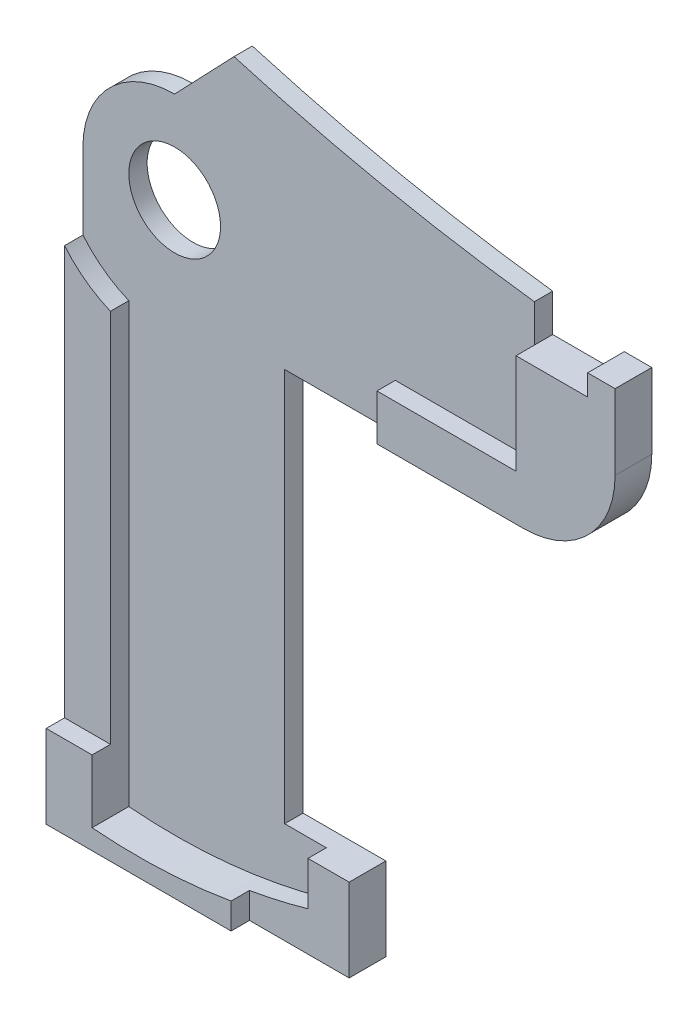
ISO-10303-21;
HEADER;
FILE_DESCRIPTION(('STEP AP214'),'2;1');
FILE_NAME('part.step','',(''),(''),'','','');
FILE_SCHEMA(('AUTOMOTIVE_DESIGN { 1 0 10303 214 1 1 1 1 }'));
ENDSEC;
DATA;
#1=APPLICATION_CONTEXT('core data for automotive mechanical design processes');
#2=APPLICATION_PROTOCOL_DEFINITION('international standard','automotive_design',2000,#1);
#3=PRODUCT_CONTEXT('',#1,'mechanical');
#4=PRODUCT('Part','Part','',(#3));
#5=PRODUCT_RELATED_PRODUCT_CATEGORY('part','',(#4));
#6=PRODUCT_DEFINITION_FORMATION('','',#4);
#7=PRODUCT_DEFINITION_CONTEXT('part definition',#1,'design');
#8=PRODUCT_DEFINITION('design','',#6,#7);
#9=PRODUCT_DEFINITION_SHAPE('','',#8);
#10=(LENGTH_UNIT() NAMED_UNIT(*) SI_UNIT(.MILLI.,.METRE.));
#11=(NAMED_UNIT(*) PLANE_ANGLE_UNIT() SI_UNIT($,.RADIAN.));
#12=(NAMED_UNIT(*) SI_UNIT($,.STERADIAN.) SOLID_ANGLE_UNIT());
#13=UNCERTAINTY_MEASURE_WITH_UNIT(LENGTH_MEASURE(1.E-05),#10,'distance_accuracy_value','');
#14=(GEOMETRIC_REPRESENTATION_CONTEXT(3) GLOBAL_UNCERTAINTY_ASSIGNED_CONTEXT((#13)) GLOBAL_UNIT_ASSIGNED_CONTEXT((#10,
#11,#12)) REPRESENTATION_CONTEXT('',''));
#15=CARTESIAN_POINT('',(0.,0.,0.));
#16=DIRECTION('',(0.,0.,1.));
#17=DIRECTION('',(1.,0.,0.));
#18=AXIS2_PLACEMENT_3D('',#15,#16,#17);
#19=CARTESIAN_POINT('',(0.,0.,3.));
#20=DIRECTION('',(0.,0.,-1.));
#21=DIRECTION('',(-1.,0.,0.));
#22=AXIS2_PLACEMENT_3D('',#19,#20,#21);
#23=CYLINDRICAL_SURFACE('',#22,29.9788961882798);
#24=CARTESIAN_POINT('',(0.,0.,1.));
#25=DIRECTION('',(0.,0.,1.));
#26=DIRECTION('',(1.,0.,0.));
#27=AXIS2_PLACEMENT_3D('',#24,#25,#26);
#28=CIRCLE('',#27,29.9788961882798);
#29=CARTESIAN_POINT('',(-2.5,-29.8744743329093,1.));
#30=VERTEX_POINT('',#29);
#31=CARTESIAN_POINT('',(8.264928228499,-28.8170987097143,1.));
#32=VERTEX_POINT('',#31);
#33=EDGE_CURVE('E296',#30,#32,#28,.T.);
#34=ORIENTED_EDGE('',*,*,#33,.F.);
#35=DIRECTION('',(0.,0.,-1.));
#36=VECTOR('',#35,1.);
#37=CARTESIAN_POINT('',(-2.5,-29.8744743329093,3.));
#38=LINE('',#37,#36);
#39=CARTESIAN_POINT('',(-2.5,-29.8744743329093,3.));
#40=VERTEX_POINT('',#39);
#41=EDGE_CURVE('E11',#40,#30,#38,.T.);
#42=ORIENTED_EDGE('',*,*,#41,.F.);
#43=CARTESIAN_POINT('',(0.,0.,3.));
#44=DIRECTION('',(0.,0.,1.));
#45=DIRECTION('',(1.,0.,0.));
#46=AXIS2_PLACEMENT_3D('',#43,#44,#45);
#47=CIRCLE('',#46,29.9788961882798);
#48=CARTESIAN_POINT('',(5.07614132551865,-29.5460150597507,3.));
#49=VERTEX_POINT('',#48);
#50=EDGE_CURVE('E425',#40,#49,#47,.T.);
#51=ORIENTED_EDGE('',*,*,#50,.T.);
#52=DIRECTION('',(0.,0.,-1.));
#53=VECTOR('',#52,1.);
#54=CARTESIAN_POINT('',(5.07614132551865,-29.5460150597507,3.));
#55=LINE('',#54,#53);
#56=CARTESIAN_POINT('',(5.07614132551865,-29.5460150597507,2.));
#57=VERTEX_POINT('',#56);
#58=EDGE_CURVE('E441',#49,#57,#55,.T.);
#59=ORIENTED_EDGE('',*,*,#58,.T.);
#60=CARTESIAN_POINT('',(0.,0.,2.));
#61=DIRECTION('',(0.,0.,1.));
#62=DIRECTION('',(1.,0.,0.));
#63=AXIS2_PLACEMENT_3D('',#60,#61,#62);
#64=CIRCLE('',#63,29.9788961882798);
#65=CARTESIAN_POINT('',(8.264928228499,-28.8170987097143,2.));
#66=VERTEX_POINT('',#65);
#67=EDGE_CURVE('E393',#57,#66,#64,.T.);
#68=ORIENTED_EDGE('',*,*,#67,.T.);
#69=DIRECTION('',(0.,0.,-1.));
#70=VECTOR('',#69,1.);
#71=CARTESIAN_POINT('',(8.264928228499,-28.8170987097143,2.));
#72=LINE('',#71,#70);
#73=EDGE_CURVE('E413',#66,#32,#72,.T.);
#74=ORIENTED_EDGE('',*,*,#73,.T.);
#75=EDGE_LOOP('',(#34,#42,#51,#59,#68,#74));
#76=FACE_BOUND('',#75,.T.);
#77=ADVANCED_FACE('F35',(#76),#23,.F.);
#78=CARTESIAN_POINT('',(-2.5,0.,3.));
#79=DIRECTION('',(-1.,0.,0.));
#80=DIRECTION('',(0.,0.,1.));
#81=AXIS2_PLACEMENT_3D('',#78,#79,#80);
#82=PLANE('',#81);
#83=ORIENTED_EDGE('',*,*,#41,.T.);
#84=DIRECTION('',(0.,1.,0.));
#85=VECTOR('',#84,1.);
#86=CARTESIAN_POINT('',(-2.5,0.,1.));
#87=LINE('',#86,#85);
#88=CARTESIAN_POINT('',(-2.5,-6.,1.));
#89=VERTEX_POINT('',#88);
#90=EDGE_CURVE('E293',#30,#89,#87,.T.);
#91=ORIENTED_EDGE('',*,*,#90,.T.);
#92=DIRECTION('',(0.,0.,-1.));
#93=VECTOR('',#92,1.);
#94=CARTESIAN_POINT('',(-2.5,-6.,2.));
#95=LINE('',#94,#93);
#96=CARTESIAN_POINT('',(-2.5,-6.,2.));
#97=VERTEX_POINT('',#96);
#98=EDGE_CURVE('E376',#97,#89,#95,.T.);
#99=ORIENTED_EDGE('',*,*,#98,.F.);
#100=DIRECTION('',(0.,-1.,0.));
#101=VECTOR('',#100,1.);
#102=CARTESIAN_POINT('',(-2.5,0.,2.));
#103=LINE('',#102,#101);
#104=CARTESIAN_POINT('',(-2.5,-26.4376778251583,2.));
#105=VERTEX_POINT('',#104);
#106=EDGE_CURVE('E373',#97,#105,#103,.T.);
#107=ORIENTED_EDGE('',*,*,#106,.T.);
#108=DIRECTION('',(0.,0.,-1.));
#109=VECTOR('',#108,1.);
#110=CARTESIAN_POINT('',(-2.5,-26.4376778251583,3.));
#111=LINE('',#110,#109);
#112=CARTESIAN_POINT('',(-2.5,-26.4376778251583,3.));
#113=VERTEX_POINT('',#112);
#114=EDGE_CURVE('E43',#113,#105,#111,.T.);
#115=ORIENTED_EDGE('',*,*,#114,.F.);
#116=DIRECTION('',(0.,1.,0.));
#117=VECTOR('',#116,1.);
#118=CARTESIAN_POINT('',(-2.5,0.,3.));
#119=LINE('',#118,#117);
#120=EDGE_CURVE('E428',#40,#113,#119,.T.);
#121=ORIENTED_EDGE('',*,*,#120,.F.);
#122=EDGE_LOOP('',(#83,#91,#99,#107,#115,#121));
#123=FACE_BOUND('',#122,.T.);
#124=ADVANCED_FACE('F480',(#123),#82,.F.);
#125=CARTESIAN_POINT('',(0.,-26.4376778251583,3.));
#126=DIRECTION('',(0.,-1.,0.));
#127=DIRECTION('',(0.,0.,-1.));
#128=AXIS2_PLACEMENT_3D('',#125,#126,#127);
#129=PLANE('',#128);
#130=ORIENTED_EDGE('',*,*,#114,.T.);
#131=DIRECTION('',(-1.,0.,0.));
#132=VECTOR('',#131,1.);
#133=CARTESIAN_POINT('',(0.,-26.4376778251583,2.));
#134=LINE('',#133,#132);
#135=CARTESIAN_POINT('',(-5.,-26.4376778251583,2.));
#136=VERTEX_POINT('',#135);
#137=EDGE_CURVE('E371',#105,#136,#134,.T.);
#138=ORIENTED_EDGE('',*,*,#137,.T.);
#139=DIRECTION('',(0.,0.,-1.));
#140=VECTOR('',#139,1.);
#141=CARTESIAN_POINT('',(-5.,-26.4376778251583,3.));
#142=LINE('',#141,#140);
#143=CARTESIAN_POINT('',(-5.,-26.4376778251583,3.));
#144=VERTEX_POINT('',#143);
#145=EDGE_CURVE('E449',#144,#136,#142,.T.);
#146=ORIENTED_EDGE('',*,*,#145,.F.);
#147=DIRECTION('',(-1.,0.,0.));
#148=VECTOR('',#147,1.);
#149=CARTESIAN_POINT('',(0.,-26.4376778251583,3.));
#150=LINE('',#149,#148);
#151=EDGE_CURVE('E431',#113,#144,#150,.T.);
#152=ORIENTED_EDGE('',*,*,#151,.F.);
#153=EDGE_LOOP('',(#130,#138,#146,#152));
#154=FACE_BOUND('',#153,.T.);
#155=ADVANCED_FACE('F525',(#154),#129,.F.);
#156=CARTESIAN_POINT('',(-5.,0.,3.));
#157=DIRECTION('',(-1.,0.,0.));
#158=DIRECTION('',(0.,-1.,0.));
#159=AXIS2_PLACEMENT_3D('',#156,#157,#158);
#160=PLANE('',#159);
#161=DIRECTION('',(0.,1.,0.));
#162=VECTOR('',#161,1.);
#163=CARTESIAN_POINT('',(-5.,0.,0.));
#164=LINE('',#163,#162);
#165=CARTESIAN_POINT('',(-5.,-30.96175737993,0.));
#166=VERTEX_POINT('',#165);
#167=CARTESIAN_POINT('',(-5.,0.,0.));
#168=VERTEX_POINT('',#167);
#169=EDGE_CURVE('E424',#166,#168,#164,.T.);
#170=ORIENTED_EDGE('',*,*,#169,.F.);
#171=DIRECTION('',(0.,0.,-1.));
#172=VECTOR('',#171,1.);
#173=CARTESIAN_POINT('',(-5.,-30.96175737993,3.));
#174=LINE('',#173,#172);
#175=CARTESIAN_POINT('',(-5.,-30.96175737993,3.));
#176=VERTEX_POINT('',#175);
#177=EDGE_CURVE('E451',#176,#166,#174,.T.);
#178=ORIENTED_EDGE('',*,*,#177,.F.);
#179=DIRECTION('',(0.,1.,0.));
#180=VECTOR('',#179,1.);
#181=CARTESIAN_POINT('',(-5.,0.,3.));
#182=LINE('',#181,#180);
#183=EDGE_CURVE('E433',#176,#144,#182,.T.);
#184=ORIENTED_EDGE('',*,*,#183,.T.);
#185=ORIENTED_EDGE('',*,*,#145,.T.);
#186=DIRECTION('',(0.,1.,0.));
#187=VECTOR('',#186,1.);
#188=CARTESIAN_POINT('',(-5.,0.,2.));
#189=LINE('',#188,#187);
#190=CARTESIAN_POINT('',(-5.,-4.15331193145904,2.));
#191=VERTEX_POINT('',#190);
#192=EDGE_CURVE('E368',#136,#191,#189,.T.);
#193=ORIENTED_EDGE('',*,*,#192,.T.);
#194=DIRECTION('',(0.,0.,-1.));
#195=VECTOR('',#194,1.);
#196=CARTESIAN_POINT('',(-5.,-4.15331193145904,2.));
#197=LINE('',#196,#195);
#198=CARTESIAN_POINT('',(-5.,-4.15331193145904,1.));
#199=VERTEX_POINT('',#198);
#200=EDGE_CURVE('E379',#191,#199,#197,.T.);
#201=ORIENTED_EDGE('',*,*,#200,.T.);
#202=DIRECTION('',(0.,1.,0.));
#203=VECTOR('',#202,1.);
#204=CARTESIAN_POINT('',(-5.,0.,1.));
#205=LINE('',#204,#203);
#206=CARTESIAN_POINT('',(-5.,0.,1.));
#207=VERTEX_POINT('',#206);
#208=EDGE_CURVE('E325',#199,#207,#205,.T.);
#209=ORIENTED_EDGE('',*,*,#208,.T.);
#210=DIRECTION('',(0.,0.,-1.));
#211=VECTOR('',#210,1.);
#212=CARTESIAN_POINT('',(-5.,0.,1.));
#213=LINE('',#212,#211);
#214=EDGE_CURVE('E333',#207,#168,#213,.T.);
#215=ORIENTED_EDGE('',*,*,#214,.T.);
#216=EDGE_LOOP('',(#170,#178,#184,#185,#193,#201,#209,#215));
#217=FACE_BOUND('',#216,.T.);
#218=ADVANCED_FACE('F490',(#217),#160,.T.);
#219=CARTESIAN_POINT('',(0.,-30.96175737993,3.));
#220=DIRECTION('',(0.,1.,0.));
#221=DIRECTION('',(0.,0.,1.));
#222=AXIS2_PLACEMENT_3D('',#219,#220,#221);
#223=PLANE('',#222);
#224=DIRECTION('',(1.,0.,0.));
#225=VECTOR('',#224,1.);
#226=CARTESIAN_POINT('',(0.,-30.96175737993,0.));
#227=LINE('',#226,#225);
#228=CARTESIAN_POINT('',(10.5082524027864,-30.96175737993,0.));
#229=VERTEX_POINT('',#228);
#230=EDGE_CURVE('E429',#166,#229,#227,.T.);
#231=ORIENTED_EDGE('',*,*,#230,.T.);
#232=DIRECTION('',(0.,0.,-1.));
#233=VECTOR('',#232,1.);
#234=CARTESIAN_POINT('',(10.5082524027864,-30.96175737993,2.));
#235=LINE('',#234,#233);
#236=CARTESIAN_POINT('',(10.5082524027864,-30.96175737993,2.));
#237=VERTEX_POINT('',#236);
#238=EDGE_CURVE('E421',#237,#229,#235,.T.);
#239=ORIENTED_EDGE('',*,*,#238,.F.);
#240=DIRECTION('',(1.,0.,0.));
#241=VECTOR('',#240,1.);
#242=CARTESIAN_POINT('',(0.,-30.96175737993,2.));
#243=LINE('',#242,#241);
#244=CARTESIAN_POINT('',(5.07614132551865,-30.96175737993,2.));
#245=VERTEX_POINT('',#244);
#246=EDGE_CURVE('E392',#245,#237,#243,.T.);
#247=ORIENTED_EDGE('',*,*,#246,.F.);
#248=DIRECTION('',(0.,0.,-1.));
#249=VECTOR('',#248,1.);
#250=CARTESIAN_POINT('',(5.07614132551865,-30.96175737993,3.));
#251=LINE('',#250,#249);
#252=CARTESIAN_POINT('',(5.07614132551865,-30.96175737993,3.));
#253=VERTEX_POINT('',#252);
#254=EDGE_CURVE('E394',#253,#245,#251,.T.);
#255=ORIENTED_EDGE('',*,*,#254,.F.);
#256=DIRECTION('',(1.,0.,0.));
#257=VECTOR('',#256,1.);
#258=CARTESIAN_POINT('',(0.,-30.96175737993,3.));
#259=LINE('',#258,#257);
#260=EDGE_CURVE('E436',#176,#253,#259,.T.);
#261=ORIENTED_EDGE('',*,*,#260,.F.);
#262=ORIENTED_EDGE('',*,*,#177,.T.);
#263=EDGE_LOOP('',(#231,#239,#247,#255,#261,#262));
#264=FACE_BOUND('',#263,.T.);
#265=ADVANCED_FACE('F463',(#264),#223,.F.);
#266=CARTESIAN_POINT('',(5.07614132551865,0.,3.));
#267=DIRECTION('',(1.,0.,0.));
#268=DIRECTION('',(0.,0.,-1.));
#269=AXIS2_PLACEMENT_3D('',#266,#267,#268);
#270=PLANE('',#269);
#271=DIRECTION('',(0.,-1.,0.));
#272=VECTOR('',#271,1.);
#273=CARTESIAN_POINT('',(5.07614132551865,0.,2.));
#274=LINE('',#273,#272);
#275=EDGE_CURVE('E388',#57,#245,#274,.T.);
#276=ORIENTED_EDGE('',*,*,#275,.F.);
#277=ORIENTED_EDGE('',*,*,#58,.F.);
#278=DIRECTION('',(0.,-1.,0.));
#279=VECTOR('',#278,1.);
#280=CARTESIAN_POINT('',(5.07614132551865,0.,3.));
#281=LINE('',#280,#279);
#282=EDGE_CURVE('E438',#49,#253,#281,.T.);
#283=ORIENTED_EDGE('',*,*,#282,.T.);
#284=ORIENTED_EDGE('',*,*,#254,.T.);
#285=EDGE_LOOP('',(#276,#277,#283,#284));
#286=FACE_BOUND('',#285,.T.);
#287=ADVANCED_FACE('F457',(#286),#270,.T.);
#288=CARTESIAN_POINT('',(0.,0.,3.));
#289=DIRECTION('',(0.,0.,1.));
#290=DIRECTION('',(1.,0.,0.));
#291=AXIS2_PLACEMENT_3D('',#288,#289,#290);
#292=PLANE('',#291);
#293=ORIENTED_EDGE('',*,*,#50,.F.);
#294=ORIENTED_EDGE('',*,*,#120,.T.);
#295=ORIENTED_EDGE('',*,*,#151,.T.);
#296=ORIENTED_EDGE('',*,*,#183,.F.);
#297=ORIENTED_EDGE('',*,*,#260,.T.);
#298=ORIENTED_EDGE('',*,*,#282,.F.);
#299=EDGE_LOOP('',(#293,#294,#295,#296,#297,#298));
#300=FACE_BOUND('',#299,.T.);
#301=ADVANCED_FACE('F485',(#300),#292,.T.);
#302=CARTESIAN_POINT('',(0.,0.,0.));
#303=DIRECTION('',(0.,0.,1.));
#304=DIRECTION('',(1.,0.,0.));
#305=AXIS2_PLACEMENT_3D('',#302,#303,#304);
#306=PLANE('',#305);
#307=CARTESIAN_POINT('',(20.,0.,0.));
#308=DIRECTION('',(0.,0.,1.));
#309=DIRECTION('',(1.,0.,0.));
#310=AXIS2_PLACEMENT_3D('',#307,#308,#309);
#311=CIRCLE('',#310,5.);
#312=CARTESIAN_POINT('',(25.,0.,0.));
#313=VERTEX_POINT('',#312);
#314=CARTESIAN_POINT('',(20.,-5.,0.));
#315=VERTEX_POINT('',#314);
#316=EDGE_CURVE('E227',#313,#315,#311,.F.);
#317=ORIENTED_EDGE('',*,*,#316,.T.);
#318=DIRECTION('',(-1.,0.,0.));
#319=VECTOR('',#318,1.);
#320=CARTESIAN_POINT('',(0.,-5.,0.));
#321=LINE('',#320,#319);
#322=CARTESIAN_POINT('',(5.99486892375012,-5.,0.));
#323=VERTEX_POINT('',#322);
#324=EDGE_CURVE('E336',#315,#323,#321,.T.);
#325=ORIENTED_EDGE('',*,*,#324,.T.);
#326=DIRECTION('',(0.,-1.,0.));
#327=VECTOR('',#326,1.);
#328=CARTESIAN_POINT('',(5.99486892375012,0.,0.));
#329=LINE('',#328,#327);
#330=CARTESIAN_POINT('',(5.99486892375012,-26.4376778251583,0.));
#331=VERTEX_POINT('',#330);
#332=EDGE_CURVE('E232',#323,#331,#329,.T.);
#333=ORIENTED_EDGE('',*,*,#332,.T.);
#334=DIRECTION('',(-1.,0.,0.));
#335=VECTOR('',#334,1.);
#336=CARTESIAN_POINT('',(0.,-26.4376778251583,0.));
#337=LINE('',#336,#335);
#338=CARTESIAN_POINT('',(10.5082524027864,-26.4376778251583,0.));
#339=VERTEX_POINT('',#338);
#340=EDGE_CURVE('E400',#339,#331,#337,.T.);
#341=ORIENTED_EDGE('',*,*,#340,.F.);
#342=DIRECTION('',(0.,1.,0.));
#343=VECTOR('',#342,1.);
#344=CARTESIAN_POINT('',(10.5082524027864,0.,0.));
#345=LINE('',#344,#343);
#346=EDGE_CURVE('E382',#229,#339,#345,.T.);
#347=ORIENTED_EDGE('',*,*,#346,.F.);
#348=ORIENTED_EDGE('',*,*,#230,.F.);
#349=ORIENTED_EDGE('',*,*,#169,.T.);
#350=CARTESIAN_POINT('',(0.,0.,0.));
#351=DIRECTION('',(0.,0.,1.));
#352=DIRECTION('',(1.,0.,0.));
#353=AXIS2_PLACEMENT_3D('',#350,#351,#352);
#354=CIRCLE('',#353,5.);
#355=CARTESIAN_POINT('',(0.,5.,0.));
#356=VERTEX_POINT('',#355);
#357=EDGE_CURVE('E347',#356,#168,#354,.T.);
#358=ORIENTED_EDGE('',*,*,#357,.F.);
#359=DIRECTION('',(0.690746158596746,0.723097327047915,0.));
#360=VECTOR('',#359,1.);
#361=CARTESIAN_POINT('',(-2.49738350474961,2.3856512780808,0.));
#362=LINE('',#361,#360);
#363=CARTESIAN_POINT('',(3.23191218549823,8.38327913011483,0.));
#364=VERTEX_POINT('',#363);
#365=EDGE_CURVE('E344',#356,#364,#362,.T.);
#366=ORIENTED_EDGE('',*,*,#365,.T.);
#367=CARTESIAN_POINT('',(32.2464718792214,107.468341250552,0.));
#368=DIRECTION('',(0.,0.,1.));
#369=DIRECTION('',(1.,0.,0.));
#370=AXIS2_PLACEMENT_3D('',#367,#368,#369);
#371=CIRCLE('',#370,103.245795118405);
#372=CARTESIAN_POINT('',(19.6,5.,0.));
#373=VERTEX_POINT('',#372);
#374=EDGE_CURVE('E341',#373,#364,#371,.F.);
#375=ORIENTED_EDGE('',*,*,#374,.F.);
#376=DIRECTION('',(0.,-1.,0.));
#377=VECTOR('',#376,1.);
#378=CARTESIAN_POINT('',(19.6,0.,0.));
#379=LINE('',#378,#377);
#380=CARTESIAN_POINT('',(19.6,2.95072846517236,0.));
#381=VERTEX_POINT('',#380);
#382=EDGE_CURVE('E339',#373,#381,#379,.T.);
#383=ORIENTED_EDGE('',*,*,#382,.T.);
#384=DIRECTION('',(1.,0.,0.));
#385=VECTOR('',#384,1.);
#386=CARTESIAN_POINT('',(0.,2.95072846517236,0.));
#387=LINE('',#386,#385);
#388=CARTESIAN_POINT('',(23.5024990927655,2.95072846517236,0.));
#389=VERTEX_POINT('',#388);
#390=EDGE_CURVE('E243',#381,#389,#387,.T.);
#391=ORIENTED_EDGE('',*,*,#390,.T.);
#392=DIRECTION('',(0.,1.,0.));
#393=VECTOR('',#392,1.);
#394=CARTESIAN_POINT('',(23.5024990927655,0.,0.));
#395=LINE('',#394,#393);
#396=CARTESIAN_POINT('',(23.5024990927655,4.0959165898472,0.));
#397=VERTEX_POINT('',#396);
#398=EDGE_CURVE('E270',#389,#397,#395,.T.);
#399=ORIENTED_EDGE('',*,*,#398,.T.);
#400=DIRECTION('',(1.,0.,0.));
#401=VECTOR('',#400,1.);
#402=CARTESIAN_POINT('',(0.,4.0959165898472,0.));
#403=LINE('',#402,#401);
#404=CARTESIAN_POINT('',(25.,4.0959165898472,0.));
#405=VERTEX_POINT('',#404);
#406=EDGE_CURVE('E267',#397,#405,#403,.T.);
#407=ORIENTED_EDGE('',*,*,#406,.T.);
#408=DIRECTION('',(0.,-1.,0.));
#409=VECTOR('',#408,1.);
#410=CARTESIAN_POINT('',(25.,0.,0.));
#411=LINE('',#410,#409);
#412=EDGE_CURVE('E265',#405,#313,#411,.T.);
#413=ORIENTED_EDGE('',*,*,#412,.T.);
#414=EDGE_LOOP('',(#317,#325,#333,#341,#347,#348,#349,#358,#366,#375,#383,#391,#399,#407,#413));
#415=FACE_BOUND('',#414,.T.);
#416=CARTESIAN_POINT('',(0.,0.,0.));
#417=DIRECTION('',(0.,0.,1.));
#418=DIRECTION('',(1.,0.,0.));
#419=AXIS2_PLACEMENT_3D('',#416,#417,#418);
#420=CIRCLE('',#419,2.5);
#421=CARTESIAN_POINT('',(2.5,0.,0.));
#422=VERTEX_POINT('',#421);
#423=EDGE_CURVE('E297',#422,#422,#420,.T.);
#424=ORIENTED_EDGE('',*,*,#423,.T.);
#425=EDGE_LOOP('',(#424));
#426=FACE_BOUND('',#425,.T.);
#427=ADVANCED_FACE('F495',(#415,#426),#306,.F.);
#428=CARTESIAN_POINT('',(10.5082524027864,0.,2.));
#429=DIRECTION('',(-1.,0.,0.));
#430=DIRECTION('',(0.,0.,1.));
#431=AXIS2_PLACEMENT_3D('',#428,#429,#430);
#432=PLANE('',#431);
#433=ORIENTED_EDGE('',*,*,#346,.T.);
#434=DIRECTION('',(0.,0.,-1.));
#435=VECTOR('',#434,1.);
#436=CARTESIAN_POINT('',(10.5082524027864,-26.4376778251583,2.));
#437=LINE('',#436,#435);
#438=CARTESIAN_POINT('',(10.5082524027864,-26.4376778251583,2.));
#439=VERTEX_POINT('',#438);
#440=EDGE_CURVE('E419',#439,#339,#437,.T.);
#441=ORIENTED_EDGE('',*,*,#440,.F.);
#442=DIRECTION('',(0.,1.,0.));
#443=VECTOR('',#442,1.);
#444=CARTESIAN_POINT('',(10.5082524027864,0.,2.));
#445=LINE('',#444,#443);
#446=EDGE_CURVE('E385',#237,#439,#445,.T.);
#447=ORIENTED_EDGE('',*,*,#446,.F.);
#448=ORIENTED_EDGE('',*,*,#238,.T.);
#449=EDGE_LOOP('',(#433,#441,#447,#448));
#450=FACE_BOUND('',#449,.T.);
#451=ADVANCED_FACE('F468',(#450),#432,.F.);
#452=CARTESIAN_POINT('',(0.,-26.4376778251583,2.));
#453=DIRECTION('',(0.,-1.,0.));
#454=DIRECTION('',(0.,0.,-1.));
#455=AXIS2_PLACEMENT_3D('',#452,#453,#454);
#456=PLANE('',#455);
#457=ORIENTED_EDGE('',*,*,#340,.T.);
#458=DIRECTION('',(0.,0.,-1.));
#459=VECTOR('',#458,1.);
#460=CARTESIAN_POINT('',(5.99486892375012,-26.4376778251583,1.));
#461=LINE('',#460,#459);
#462=CARTESIAN_POINT('',(5.99486892375012,-26.4376778251583,1.));
#463=VERTEX_POINT('',#462);
#464=EDGE_CURVE('E362',#463,#331,#461,.T.);
#465=ORIENTED_EDGE('',*,*,#464,.F.);
#466=DIRECTION('',(-1.,0.,0.));
#467=VECTOR('',#466,1.);
#468=CARTESIAN_POINT('',(0.,-26.4376778251583,1.));
#469=LINE('',#468,#467);
#470=CARTESIAN_POINT('',(8.264928228499,-26.4376778251583,1.));
#471=VERTEX_POINT('',#470);
#472=EDGE_CURVE('E302',#471,#463,#469,.T.);
#473=ORIENTED_EDGE('',*,*,#472,.F.);
#474=DIRECTION('',(0.,0.,-1.));
#475=VECTOR('',#474,1.);
#476=CARTESIAN_POINT('',(8.264928228499,-26.4376778251583,2.));
#477=LINE('',#476,#475);
#478=CARTESIAN_POINT('',(8.264928228499,-26.4376778251583,2.));
#479=VERTEX_POINT('',#478);
#480=EDGE_CURVE('E415',#479,#471,#477,.T.);
#481=ORIENTED_EDGE('',*,*,#480,.F.);
#482=DIRECTION('',(-1.,0.,0.));
#483=VECTOR('',#482,1.);
#484=CARTESIAN_POINT('',(0.,-26.4376778251583,2.));
#485=LINE('',#484,#483);
#486=EDGE_CURVE('E470',#439,#479,#485,.T.);
#487=ORIENTED_EDGE('',*,*,#486,.F.);
#488=ORIENTED_EDGE('',*,*,#440,.T.);
#489=EDGE_LOOP('',(#457,#465,#473,#481,#487,#488));
#490=FACE_BOUND('',#489,.T.);
#491=ADVANCED_FACE('F498',(#490),#456,.F.);
#492=CARTESIAN_POINT('',(8.264928228499,0.,2.));
#493=DIRECTION('',(1.,0.,0.));
#494=DIRECTION('',(0.,0.,-1.));
#495=AXIS2_PLACEMENT_3D('',#492,#493,#494);
#496=PLANE('',#495);
#497=ORIENTED_EDGE('',*,*,#480,.T.);
#498=DIRECTION('',(0.,-1.,0.));
#499=VECTOR('',#498,1.);
#500=CARTESIAN_POINT('',(8.264928228499,0.,1.));
#501=LINE('',#500,#499);
#502=EDGE_CURVE('E299',#471,#32,#501,.T.);
#503=ORIENTED_EDGE('',*,*,#502,.T.);
#504=ORIENTED_EDGE('',*,*,#73,.F.);
#505=DIRECTION('',(0.,-1.,0.));
#506=VECTOR('',#505,1.);
#507=CARTESIAN_POINT('',(8.264928228499,0.,2.));
#508=LINE('',#507,#506);
#509=EDGE_CURVE('E416',#479,#66,#508,.T.);
#510=ORIENTED_EDGE('',*,*,#509,.F.);
#511=EDGE_LOOP('',(#497,#503,#504,#510));
#512=FACE_BOUND('',#511,.T.);
#513=ADVANCED_FACE('F475',(#512),#496,.F.);
#514=CARTESIAN_POINT('',(0.,0.,2.));
#515=DIRECTION('',(0.,0.,1.));
#516=DIRECTION('',(1.,0.,0.));
#517=AXIS2_PLACEMENT_3D('',#514,#515,#516);
#518=PLANE('',#517);
#519=ORIENTED_EDGE('',*,*,#67,.F.);
#520=ORIENTED_EDGE('',*,*,#275,.T.);
#521=ORIENTED_EDGE('',*,*,#246,.T.);
#522=ORIENTED_EDGE('',*,*,#446,.T.);
#523=ORIENTED_EDGE('',*,*,#486,.T.);
#524=ORIENTED_EDGE('',*,*,#509,.T.);
#525=EDGE_LOOP('',(#519,#520,#521,#522,#523,#524));
#526=FACE_BOUND('',#525,.T.);
#527=ADVANCED_FACE('F461',(#526),#518,.T.);
#528=CARTESIAN_POINT('',(0.,0.,2.));
#529=DIRECTION('',(0.,0.,-1.));
#530=DIRECTION('',(-1.,0.,0.));
#531=AXIS2_PLACEMENT_3D('',#528,#529,#530);
#532=CYLINDRICAL_SURFACE('',#531,6.5);
#533=CARTESIAN_POINT('',(0.,0.,1.));
#534=DIRECTION('',(0.,0.,1.));
#535=DIRECTION('',(1.,0.,0.));
#536=AXIS2_PLACEMENT_3D('',#533,#534,#535);
#537=CIRCLE('',#536,6.5);
#538=EDGE_CURVE('E328',#199,#89,#537,.T.);
#539=ORIENTED_EDGE('',*,*,#538,.F.);
#540=ORIENTED_EDGE('',*,*,#200,.F.);
#541=CARTESIAN_POINT('',(0.,0.,2.));
#542=DIRECTION('',(0.,0.,1.));
#543=DIRECTION('',(1.,0.,0.));
#544=AXIS2_PLACEMENT_3D('',#541,#542,#543);
#545=CIRCLE('',#544,6.5);
#546=EDGE_CURVE('E365',#191,#97,#545,.T.);
#547=ORIENTED_EDGE('',*,*,#546,.T.);
#548=ORIENTED_EDGE('',*,*,#98,.T.);
#549=EDGE_LOOP('',(#539,#540,#547,#548));
#550=FACE_BOUND('',#549,.T.);
#551=ADVANCED_FACE('F614',(#550),#532,.F.);
#552=CARTESIAN_POINT('',(0.,0.,2.));
#553=DIRECTION('',(0.,0.,1.));
#554=DIRECTION('',(1.,0.,0.));
#555=AXIS2_PLACEMENT_3D('',#552,#553,#554);
#556=PLANE('',#555);
#557=ORIENTED_EDGE('',*,*,#546,.F.);
#558=ORIENTED_EDGE('',*,*,#192,.F.);
#559=ORIENTED_EDGE('',*,*,#137,.F.);
#560=ORIENTED_EDGE('',*,*,#106,.F.);
#561=EDGE_LOOP('',(#557,#558,#559,#560));
#562=FACE_BOUND('',#561,.T.);
#563=ADVANCED_FACE('F622',(#562),#556,.T.);
#564=CARTESIAN_POINT('',(5.99486892375012,0.,1.));
#565=DIRECTION('',(1.,0.,0.));
#566=DIRECTION('',(0.,1.,0.));
#567=AXIS2_PLACEMENT_3D('',#564,#565,#566);
#568=PLANE('',#567);
#569=ORIENTED_EDGE('',*,*,#332,.F.);
#570=DIRECTION('',(0.,0.,-1.));
#571=VECTOR('',#570,1.);
#572=CARTESIAN_POINT('',(5.99486892375012,-5.,1.));
#573=LINE('',#572,#571);
#574=CARTESIAN_POINT('',(5.99486892375012,-5.,1.));
#575=VERTEX_POINT('',#574);
#576=EDGE_CURVE('E360',#575,#323,#573,.T.);
#577=ORIENTED_EDGE('',*,*,#576,.F.);
#578=DIRECTION('',(0.,-1.,0.));
#579=VECTOR('',#578,1.);
#580=CARTESIAN_POINT('',(5.99486892375012,0.,1.));
#581=LINE('',#580,#579);
#582=EDGE_CURVE('E304',#575,#463,#581,.T.);
#583=ORIENTED_EDGE('',*,*,#582,.T.);
#584=ORIENTED_EDGE('',*,*,#464,.T.);
#585=EDGE_LOOP('',(#569,#577,#583,#584));
#586=FACE_BOUND('',#585,.T.);
#587=ADVANCED_FACE('F631',(#586),#568,.T.);
#588=CARTESIAN_POINT('',(0.,-5.,1.));
#589=DIRECTION('',(0.,-1.,0.));
#590=DIRECTION('',(0.,0.,-1.));
#591=AXIS2_PLACEMENT_3D('',#588,#589,#590);
#592=PLANE('',#591);
#593=ORIENTED_EDGE('',*,*,#324,.F.);
#594=DIRECTION('',(0.,0.,-1.));
#595=VECTOR('',#594,1.);
#596=CARTESIAN_POINT('',(20.,-5.,2.));
#597=LINE('',#596,#595);
#598=CARTESIAN_POINT('',(20.,-5.,2.));
#599=VERTEX_POINT('',#598);
#600=EDGE_CURVE('E263',#599,#315,#597,.T.);
#601=ORIENTED_EDGE('',*,*,#600,.F.);
#602=DIRECTION('',(-1.,0.,0.));
#603=VECTOR('',#602,1.);
#604=CARTESIAN_POINT('',(0.,-5.,2.));
#605=LINE('',#604,#603);
#606=CARTESIAN_POINT('',(12.0231573181287,-5.,2.));
#607=VERTEX_POINT('',#606);
#608=EDGE_CURVE('E242',#599,#607,#605,.T.);
#609=ORIENTED_EDGE('',*,*,#608,.T.);
#610=DIRECTION('',(0.,0.,-1.));
#611=VECTOR('',#610,1.);
#612=CARTESIAN_POINT('',(12.0231573181287,-5.,2.));
#613=LINE('',#612,#611);
#614=CARTESIAN_POINT('',(12.0231573181287,-5.,1.));
#615=VERTEX_POINT('',#614);
#616=EDGE_CURVE('E276',#607,#615,#613,.T.);
#617=ORIENTED_EDGE('',*,*,#616,.T.);
#618=DIRECTION('',(-1.,0.,0.));
#619=VECTOR('',#618,1.);
#620=CARTESIAN_POINT('',(0.,-5.,1.));
#621=LINE('',#620,#619);
#622=EDGE_CURVE('E307',#615,#575,#621,.T.);
#623=ORIENTED_EDGE('',*,*,#622,.T.);
#624=ORIENTED_EDGE('',*,*,#576,.T.);
#625=EDGE_LOOP('',(#593,#601,#609,#617,#623,#624));
#626=FACE_BOUND('',#625,.T.);
#627=ADVANCED_FACE('F753',(#626),#592,.T.);
#628=CARTESIAN_POINT('',(19.6,0.,1.));
#629=DIRECTION('',(1.,0.,0.));
#630=DIRECTION('',(0.,0.,-1.));
#631=AXIS2_PLACEMENT_3D('',#628,#629,#630);
#632=PLANE('',#631);
#633=DIRECTION('',(0.,0.,-1.));
#634=VECTOR('',#633,1.);
#635=CARTESIAN_POINT('',(19.6,2.95072846517236,2.));
#636=LINE('',#635,#634);
#637=CARTESIAN_POINT('',(19.6,2.95072846517236,1.));
#638=VERTEX_POINT('',#637);
#639=EDGE_CURVE('E51',#638,#381,#636,.T.);
#640=ORIENTED_EDGE('',*,*,#639,.T.);
#641=ORIENTED_EDGE('',*,*,#382,.F.);
#642=DIRECTION('',(0.,0.,-1.));
#643=VECTOR('',#642,1.);
#644=CARTESIAN_POINT('',(19.6,5.,1.));
#645=LINE('',#644,#643);
#646=CARTESIAN_POINT('',(19.6,5.,1.));
#647=VERTEX_POINT('',#646);
#648=EDGE_CURVE('E358',#647,#373,#645,.T.);
#649=ORIENTED_EDGE('',*,*,#648,.F.);
#650=DIRECTION('',(0.,-1.,0.));
#651=VECTOR('',#650,1.);
#652=CARTESIAN_POINT('',(19.6,0.,1.));
#653=LINE('',#652,#651);
#654=EDGE_CURVE('E316',#647,#638,#653,.T.);
#655=ORIENTED_EDGE('',*,*,#654,.T.);
#656=EDGE_LOOP('',(#640,#641,#649,#655));
#657=FACE_BOUND('',#656,.T.);
#658=ADVANCED_FACE('F745',(#657),#632,.T.);
#659=CARTESIAN_POINT('',(32.2464718792214,107.468341250552,1.));
#660=DIRECTION('',(0.,0.,-1.));
#661=DIRECTION('',(-1.,0.,0.));
#662=AXIS2_PLACEMENT_3D('',#659,#660,#661);
#663=CYLINDRICAL_SURFACE('',#662,103.245795118405);
#664=ORIENTED_EDGE('',*,*,#374,.T.);
#665=DIRECTION('',(0.,0.,-1.));
#666=VECTOR('',#665,1.);
#667=CARTESIAN_POINT('',(3.23191218549823,8.38327913011483,1.));
#668=LINE('',#667,#666);
#669=CARTESIAN_POINT('',(3.23191218549823,8.38327913011483,1.));
#670=VERTEX_POINT('',#669);
#671=EDGE_CURVE('E356',#670,#364,#668,.T.);
#672=ORIENTED_EDGE('',*,*,#671,.F.);
#673=CARTESIAN_POINT('',(32.2464718792214,107.468341250552,1.));
#674=DIRECTION('',(0.,0.,1.));
#675=DIRECTION('',(1.,0.,0.));
#676=AXIS2_PLACEMENT_3D('',#673,#674,#675);
#677=CIRCLE('',#676,103.245795118405);
#678=EDGE_CURVE('E318',#647,#670,#677,.F.);
#679=ORIENTED_EDGE('',*,*,#678,.F.);
#680=ORIENTED_EDGE('',*,*,#648,.T.);
#681=EDGE_LOOP('',(#664,#672,#679,#680));
#682=FACE_BOUND('',#681,.T.);
#683=ADVANCED_FACE('F737',(#682),#663,.F.);
#684=CARTESIAN_POINT('',(-2.49738350474961,2.3856512780808,1.));
#685=DIRECTION('',(-0.723097327047915,0.690746158596746,0.));
#686=DIRECTION('',(-0.690746158596746,-0.723097327047915,0.));
#687=AXIS2_PLACEMENT_3D('',#684,#685,#686);
#688=PLANE('',#687);
#689=ORIENTED_EDGE('',*,*,#365,.F.);
#690=DIRECTION('',(0.,0.,-1.));
#691=VECTOR('',#690,1.);
#692=CARTESIAN_POINT('',(0.,5.,1.));
#693=LINE('',#692,#691);
#694=CARTESIAN_POINT('',(0.,5.,1.));
#695=VERTEX_POINT('',#694);
#696=EDGE_CURVE('E354',#695,#356,#693,.T.);
#697=ORIENTED_EDGE('',*,*,#696,.F.);
#698=DIRECTION('',(0.690746158596746,0.723097327047915,0.));
#699=VECTOR('',#698,1.);
#700=CARTESIAN_POINT('',(-2.49738350474961,2.3856512780808,1.));
#701=LINE('',#700,#699);
#702=EDGE_CURVE('E320',#695,#670,#701,.T.);
#703=ORIENTED_EDGE('',*,*,#702,.T.);
#704=ORIENTED_EDGE('',*,*,#671,.T.);
#705=EDGE_LOOP('',(#689,#697,#703,#704));
#706=FACE_BOUND('',#705,.T.);
#707=ADVANCED_FACE('F729',(#706),#688,.T.);
#708=CARTESIAN_POINT('',(0.,0.,1.));
#709=DIRECTION('',(0.,0.,-1.));
#710=DIRECTION('',(-1.,0.,0.));
#711=AXIS2_PLACEMENT_3D('',#708,#709,#710);
#712=CYLINDRICAL_SURFACE('',#711,5.);
#713=ORIENTED_EDGE('',*,*,#357,.T.);
#714=ORIENTED_EDGE('',*,*,#214,.F.);
#715=CARTESIAN_POINT('',(0.,0.,1.));
#716=DIRECTION('',(0.,0.,1.));
#717=DIRECTION('',(1.,0.,0.));
#718=AXIS2_PLACEMENT_3D('',#715,#716,#717);
#719=CIRCLE('',#718,5.);
#720=EDGE_CURVE('E323',#695,#207,#719,.T.);
#721=ORIENTED_EDGE('',*,*,#720,.F.);
#722=ORIENTED_EDGE('',*,*,#696,.T.);
#723=EDGE_LOOP('',(#713,#714,#721,#722));
#724=FACE_BOUND('',#723,.T.);
#725=ADVANCED_FACE('F509',(#724),#712,.T.);
#726=CARTESIAN_POINT('',(0.,0.,1.));
#727=DIRECTION('',(0.,0.,-1.));
#728=DIRECTION('',(-1.,0.,0.));
#729=AXIS2_PLACEMENT_3D('',#726,#727,#728);
#730=CYLINDRICAL_SURFACE('',#729,2.5);
#731=CARTESIAN_POINT('',(0.,0.,1.));
#732=DIRECTION('',(0.,0.,1.));
#733=DIRECTION('',(1.,0.,0.));
#734=AXIS2_PLACEMENT_3D('',#731,#732,#733);
#735=CIRCLE('',#734,2.5);
#736=CARTESIAN_POINT('',(2.5,0.,1.));
#737=VERTEX_POINT('',#736);
#738=EDGE_CURVE('E330',#737,#737,#735,.T.);
#739=ORIENTED_EDGE('',*,*,#738,.T.);
#740=EDGE_LOOP('',(#739));
#741=FACE_BOUND('',#740,.T.);
#742=ORIENTED_EDGE('',*,*,#423,.F.);
#743=EDGE_LOOP('',(#742));
#744=FACE_BOUND('',#743,.T.);
#745=ADVANCED_FACE('F503',(#741,#744),#730,.F.);
#746=CARTESIAN_POINT('',(0.,0.,1.));
#747=DIRECTION('',(0.,0.,1.));
#748=DIRECTION('',(1.,0.,0.));
#749=AXIS2_PLACEMENT_3D('',#746,#747,#748);
#750=PLANE('',#749);
#751=ORIENTED_EDGE('',*,*,#90,.F.);
#752=ORIENTED_EDGE('',*,*,#33,.T.);
#753=ORIENTED_EDGE('',*,*,#502,.F.);
#754=ORIENTED_EDGE('',*,*,#472,.T.);
#755=ORIENTED_EDGE('',*,*,#582,.F.);
#756=ORIENTED_EDGE('',*,*,#622,.F.);
#757=DIRECTION('',(0.,-1.,0.));
#758=VECTOR('',#757,1.);
#759=CARTESIAN_POINT('',(12.0231573181287,0.,1.));
#760=LINE('',#759,#758);
#761=CARTESIAN_POINT('',(12.0231573181287,-2.5,1.));
#762=VERTEX_POINT('',#761);
#763=EDGE_CURVE('E310',#762,#615,#760,.T.);
#764=ORIENTED_EDGE('',*,*,#763,.F.);
#765=DIRECTION('',(-1.,0.,0.));
#766=VECTOR('',#765,1.);
#767=CARTESIAN_POINT('',(0.,-2.5,1.));
#768=LINE('',#767,#766);
#769=CARTESIAN_POINT('',(19.6,-2.5,1.));
#770=VERTEX_POINT('',#769);
#771=EDGE_CURVE('E313',#770,#762,#768,.T.);
#772=ORIENTED_EDGE('',*,*,#771,.F.);
#773=EDGE_CURVE('E59',#638,#770,#653,.T.);
#774=ORIENTED_EDGE('',*,*,#773,.F.);
#775=ORIENTED_EDGE('',*,*,#654,.F.);
#776=ORIENTED_EDGE('',*,*,#678,.T.);
#777=ORIENTED_EDGE('',*,*,#702,.F.);
#778=ORIENTED_EDGE('',*,*,#720,.T.);
#779=ORIENTED_EDGE('',*,*,#208,.F.);
#780=ORIENTED_EDGE('',*,*,#538,.T.);
#781=EDGE_LOOP('',(#751,#752,#753,#754,#755,#756,#764,#772,#774,#775,#776,#777,#778,#779,#780));
#782=FACE_BOUND('',#781,.T.);
#783=ORIENTED_EDGE('',*,*,#738,.F.);
#784=EDGE_LOOP('',(#783));
#785=FACE_BOUND('',#784,.T.);
#786=ADVANCED_FACE('F500',(#782,#785),#750,.T.);
#787=CARTESIAN_POINT('',(20.,0.,2.));
#788=DIRECTION('',(0.,0.,-1.));
#789=DIRECTION('',(-1.,0.,0.));
#790=AXIS2_PLACEMENT_3D('',#787,#788,#789);
#791=CYLINDRICAL_SURFACE('',#790,5.);
#792=ORIENTED_EDGE('',*,*,#316,.F.);
#793=DIRECTION('',(0.,0.,-1.));
#794=VECTOR('',#793,1.);
#795=CARTESIAN_POINT('',(25.,0.,2.));
#796=LINE('',#795,#794);
#797=CARTESIAN_POINT('',(25.,0.,2.));
#798=VERTEX_POINT('',#797);
#799=EDGE_CURVE('E220',#798,#313,#796,.T.);
#800=ORIENTED_EDGE('',*,*,#799,.F.);
#801=CARTESIAN_POINT('',(20.,0.,2.));
#802=DIRECTION('',(0.,0.,1.));
#803=DIRECTION('',(1.,0.,0.));
#804=AXIS2_PLACEMENT_3D('',#801,#802,#803);
#805=CIRCLE('',#804,5.);
#806=EDGE_CURVE('E224',#798,#599,#805,.F.);
#807=ORIENTED_EDGE('',*,*,#806,.T.);
#808=ORIENTED_EDGE('',*,*,#600,.T.);
#809=EDGE_LOOP('',(#792,#800,#807,#808));
#810=FACE_BOUND('',#809,.T.);
#811=ADVANCED_FACE('F222',(#810),#791,.T.);
#812=CARTESIAN_POINT('',(25.,0.,2.));
#813=DIRECTION('',(1.,0.,0.));
#814=DIRECTION('',(0.,0.,-1.));
#815=AXIS2_PLACEMENT_3D('',#812,#813,#814);
#816=PLANE('',#815);
#817=ORIENTED_EDGE('',*,*,#412,.F.);
#818=DIRECTION('',(0.,0.,-1.));
#819=VECTOR('',#818,1.);
#820=CARTESIAN_POINT('',(25.,4.0959165898472,2.));
#821=LINE('',#820,#819);
#822=CARTESIAN_POINT('',(25.,4.0959165898472,2.));
#823=VERTEX_POINT('',#822);
#824=EDGE_CURVE('E233',#823,#405,#821,.T.);
#825=ORIENTED_EDGE('',*,*,#824,.F.);
#826=DIRECTION('',(0.,-1.,0.));
#827=VECTOR('',#826,1.);
#828=CARTESIAN_POINT('',(25.,0.,2.));
#829=LINE('',#828,#827);
#830=EDGE_CURVE('E239',#823,#798,#829,.T.);
#831=ORIENTED_EDGE('',*,*,#830,.T.);
#832=ORIENTED_EDGE('',*,*,#799,.T.);
#833=EDGE_LOOP('',(#817,#825,#831,#832));
#834=FACE_BOUND('',#833,.T.);
#835=ADVANCED_FACE('F245',(#834),#816,.T.);
#836=CARTESIAN_POINT('',(0.,4.0959165898472,2.));
#837=DIRECTION('',(0.,1.,0.));
#838=DIRECTION('',(0.,0.,1.));
#839=AXIS2_PLACEMENT_3D('',#836,#837,#838);
#840=PLANE('',#839);
#841=ORIENTED_EDGE('',*,*,#406,.F.);
#842=DIRECTION('',(0.,0.,-1.));
#843=VECTOR('',#842,1.);
#844=CARTESIAN_POINT('',(23.5024990927655,4.0959165898472,2.));
#845=LINE('',#844,#843);
#846=CARTESIAN_POINT('',(23.5024990927655,4.0959165898472,2.));
#847=VERTEX_POINT('',#846);
#848=EDGE_CURVE('E290',#847,#397,#845,.T.);
#849=ORIENTED_EDGE('',*,*,#848,.F.);
#850=DIRECTION('',(1.,0.,0.));
#851=VECTOR('',#850,1.);
#852=CARTESIAN_POINT('',(0.,4.0959165898472,2.));
#853=LINE('',#852,#851);
#854=EDGE_CURVE('E246',#847,#823,#853,.T.);
#855=ORIENTED_EDGE('',*,*,#854,.T.);
#856=ORIENTED_EDGE('',*,*,#824,.T.);
#857=EDGE_LOOP('',(#841,#849,#855,#856));
#858=FACE_BOUND('',#857,.T.);
#859=ADVANCED_FACE('F648',(#858),#840,.T.);
#860=CARTESIAN_POINT('',(23.5024990927655,0.,2.));
#861=DIRECTION('',(-1.,0.,0.));
#862=DIRECTION('',(0.,0.,1.));
#863=AXIS2_PLACEMENT_3D('',#860,#861,#862);
#864=PLANE('',#863);
#865=ORIENTED_EDGE('',*,*,#398,.F.);
#866=DIRECTION('',(0.,0.,-1.));
#867=VECTOR('',#866,1.);
#868=CARTESIAN_POINT('',(23.5024990927655,2.95072846517236,2.));
#869=LINE('',#868,#867);
#870=CARTESIAN_POINT('',(23.5024990927655,2.95072846517236,2.));
#871=VERTEX_POINT('',#870);
#872=EDGE_CURVE('E288',#871,#389,#869,.T.);
#873=ORIENTED_EDGE('',*,*,#872,.F.);
#874=DIRECTION('',(0.,1.,0.));
#875=VECTOR('',#874,1.);
#876=CARTESIAN_POINT('',(23.5024990927655,0.,2.));
#877=LINE('',#876,#875);
#878=EDGE_CURVE('E248',#871,#847,#877,.T.);
#879=ORIENTED_EDGE('',*,*,#878,.T.);
#880=ORIENTED_EDGE('',*,*,#848,.T.);
#881=EDGE_LOOP('',(#865,#873,#879,#880));
#882=FACE_BOUND('',#881,.T.);
#883=ADVANCED_FACE('F656',(#882),#864,.T.);
#884=CARTESIAN_POINT('',(0.,2.95072846517236,2.));
#885=DIRECTION('',(0.,1.,0.));
#886=DIRECTION('',(0.,0.,1.));
#887=AXIS2_PLACEMENT_3D('',#884,#885,#886);
#888=PLANE('',#887);
#889=ORIENTED_EDGE('',*,*,#390,.F.);
#890=ORIENTED_EDGE('',*,*,#639,.F.);
#891=CARTESIAN_POINT('',(19.6,2.95072846517236,2.));
#892=VERTEX_POINT('',#891);
#893=EDGE_CURVE('E285',#892,#638,#636,.T.);
#894=ORIENTED_EDGE('',*,*,#893,.F.);
#895=DIRECTION('',(1.,0.,0.));
#896=VECTOR('',#895,1.);
#897=CARTESIAN_POINT('',(0.,2.95072846517236,2.));
#898=LINE('',#897,#896);
#899=EDGE_CURVE('E253',#892,#871,#898,.T.);
#900=ORIENTED_EDGE('',*,*,#899,.T.);
#901=ORIENTED_EDGE('',*,*,#872,.T.);
#902=EDGE_LOOP('',(#889,#890,#894,#900,#901));
#903=FACE_BOUND('',#902,.T.);
#904=ADVANCED_FACE('F665',(#903),#888,.T.);
#905=CARTESIAN_POINT('',(19.6,0.,2.));
#906=DIRECTION('',(1.,0.,0.));
#907=DIRECTION('',(0.,0.,-1.));
#908=AXIS2_PLACEMENT_3D('',#905,#906,#907);
#909=PLANE('',#908);
#910=ORIENTED_EDGE('',*,*,#773,.T.);
#911=DIRECTION('',(0.,0.,-1.));
#912=VECTOR('',#911,1.);
#913=CARTESIAN_POINT('',(19.6,-2.5,2.));
#914=LINE('',#913,#912);
#915=CARTESIAN_POINT('',(19.6,-2.5,2.));
#916=VERTEX_POINT('',#915);
#917=EDGE_CURVE('E282',#916,#770,#914,.T.);
#918=ORIENTED_EDGE('',*,*,#917,.F.);
#919=DIRECTION('',(0.,-1.,0.));
#920=VECTOR('',#919,1.);
#921=CARTESIAN_POINT('',(19.6,0.,2.));
#922=LINE('',#921,#920);
#923=EDGE_CURVE('E256',#892,#916,#922,.T.);
#924=ORIENTED_EDGE('',*,*,#923,.F.);
#925=ORIENTED_EDGE('',*,*,#893,.T.);
#926=EDGE_LOOP('',(#910,#918,#924,#925));
#927=FACE_BOUND('',#926,.T.);
#928=ADVANCED_FACE('F674',(#927),#909,.F.);
#929=CARTESIAN_POINT('',(0.,-2.5,2.));
#930=DIRECTION('',(0.,-1.,0.));
#931=DIRECTION('',(1.,0.,0.));
#932=AXIS2_PLACEMENT_3D('',#929,#930,#931);
#933=PLANE('',#932);
#934=ORIENTED_EDGE('',*,*,#771,.T.);
#935=DIRECTION('',(0.,0.,-1.));
#936=VECTOR('',#935,1.);
#937=CARTESIAN_POINT('',(12.0231573181287,-2.5,2.));
#938=LINE('',#937,#936);
#939=CARTESIAN_POINT('',(12.0231573181287,-2.5,2.));
#940=VERTEX_POINT('',#939);
#941=EDGE_CURVE('E279',#940,#762,#938,.T.);
#942=ORIENTED_EDGE('',*,*,#941,.F.);
#943=DIRECTION('',(-1.,0.,0.));
#944=VECTOR('',#943,1.);
#945=CARTESIAN_POINT('',(0.,-2.5,2.));
#946=LINE('',#945,#944);
#947=EDGE_CURVE('E258',#916,#940,#946,.T.);
#948=ORIENTED_EDGE('',*,*,#947,.F.);
#949=ORIENTED_EDGE('',*,*,#917,.T.);
#950=EDGE_LOOP('',(#934,#942,#948,#949));
#951=FACE_BOUND('',#950,.T.);
#952=ADVANCED_FACE('F683',(#951),#933,.F.);
#953=CARTESIAN_POINT('',(12.0231573181287,0.,2.));
#954=DIRECTION('',(1.,0.,0.));
#955=DIRECTION('',(0.,0.,-1.));
#956=AXIS2_PLACEMENT_3D('',#953,#954,#955);
#957=PLANE('',#956);
#958=ORIENTED_EDGE('',*,*,#763,.T.);
#959=ORIENTED_EDGE('',*,*,#616,.F.);
#960=DIRECTION('',(0.,-1.,0.));
#961=VECTOR('',#960,1.);
#962=CARTESIAN_POINT('',(12.0231573181287,0.,2.));
#963=LINE('',#962,#961);
#964=EDGE_CURVE('E260',#940,#607,#963,.T.);
#965=ORIENTED_EDGE('',*,*,#964,.F.);
#966=ORIENTED_EDGE('',*,*,#941,.T.);
#967=EDGE_LOOP('',(#958,#959,#965,#966));
#968=FACE_BOUND('',#967,.T.);
#969=ADVANCED_FACE('F692',(#968),#957,.F.);
#970=CARTESIAN_POINT('',(0.,0.,2.));
#971=DIRECTION('',(0.,0.,1.));
#972=DIRECTION('',(1.,0.,0.));
#973=AXIS2_PLACEMENT_3D('',#970,#971,#972);
#974=PLANE('',#973);
#975=ORIENTED_EDGE('',*,*,#806,.F.);
#976=ORIENTED_EDGE('',*,*,#830,.F.);
#977=ORIENTED_EDGE('',*,*,#854,.F.);
#978=ORIENTED_EDGE('',*,*,#878,.F.);
#979=ORIENTED_EDGE('',*,*,#899,.F.);
#980=ORIENTED_EDGE('',*,*,#923,.T.);
#981=ORIENTED_EDGE('',*,*,#947,.T.);
#982=ORIENTED_EDGE('',*,*,#964,.T.);
#983=ORIENTED_EDGE('',*,*,#608,.F.);
#984=EDGE_LOOP('',(#975,#976,#977,#978,#979,#980,#981,#982,#983));
#985=FACE_BOUND('',#984,.T.);
#986=ADVANCED_FACE('F237',(#985),#974,.T.);
#987=CLOSED_SHELL('',(#77,#124,#155,#218,#265,#287,#301,#427,#451,#491,#513,#527,#551,#563,#587,
#627,#658,#683,#707,#725,#745,#786,#811,#835,#859,#883,#904,#928,#952,#969,#986));
#988=MANIFOLD_SOLID_BREP('B2',#987);
#989=ADVANCED_BREP_SHAPE_REPRESENTATION('',(#18,#988),#14);
#990=SHAPE_DEFINITION_REPRESENTATION(#9,#989);
ENDSEC;
END-ISO-10303-21;
